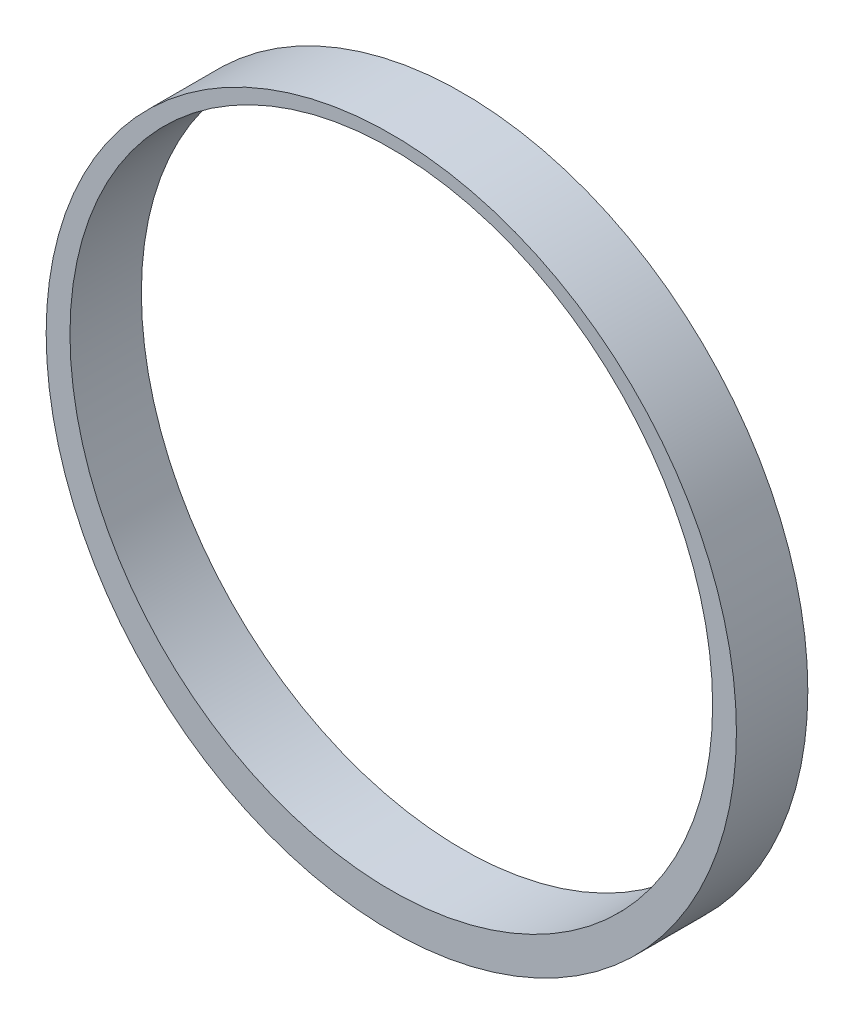
ISO-10303-21;
HEADER;
FILE_DESCRIPTION(('STEP AP214'),'2;1');
FILE_NAME('part.step','',(''),(''),'','','');
FILE_SCHEMA(('AUTOMOTIVE_DESIGN { 1 0 10303 214 1 1 1 1 }'));
ENDSEC;
DATA;
#1=APPLICATION_CONTEXT('core data for automotive mechanical design processes');
#2=APPLICATION_PROTOCOL_DEFINITION('international standard','automotive_design',2000,#1);
#3=PRODUCT_CONTEXT('',#1,'mechanical');
#4=PRODUCT('Part','Part','',(#3));
#5=PRODUCT_RELATED_PRODUCT_CATEGORY('part','',(#4));
#6=PRODUCT_DEFINITION_FORMATION('','',#4);
#7=PRODUCT_DEFINITION_CONTEXT('part definition',#1,'design');
#8=PRODUCT_DEFINITION('design','',#6,#7);
#9=PRODUCT_DEFINITION_SHAPE('','',#8);
#10=(LENGTH_UNIT() NAMED_UNIT(*) SI_UNIT(.MILLI.,.METRE.));
#11=(NAMED_UNIT(*) PLANE_ANGLE_UNIT() SI_UNIT($,.RADIAN.));
#12=(NAMED_UNIT(*) SI_UNIT($,.STERADIAN.) SOLID_ANGLE_UNIT());
#13=UNCERTAINTY_MEASURE_WITH_UNIT(LENGTH_MEASURE(1.E-05),#10,'distance_accuracy_value','');
#14=(GEOMETRIC_REPRESENTATION_CONTEXT(3) GLOBAL_UNCERTAINTY_ASSIGNED_CONTEXT((#13)) GLOBAL_UNIT_ASSIGNED_CONTEXT((#10,
#11,#12)) REPRESENTATION_CONTEXT('',''));
#15=CARTESIAN_POINT('',(0.,0.,0.));
#16=DIRECTION('',(0.,0.,1.));
#17=DIRECTION('',(1.,0.,0.));
#18=AXIS2_PLACEMENT_3D('',#15,#16,#17);
#19=CARTESIAN_POINT('',(0.,-1.89658520093627,12.));
#20=DIRECTION('',(0.,0.,-1.));
#21=DIRECTION('',(-1.,0.,0.));
#22=AXIS2_PLACEMENT_3D('',#19,#20,#21);
#23=CYLINDRICAL_SURFACE('',#22,58.);
#24=CARTESIAN_POINT('',(0.,-1.89658520093627,12.));
#25=DIRECTION('',(0.,0.,1.));
#26=DIRECTION('',(1.,0.,0.));
#27=AXIS2_PLACEMENT_3D('',#24,#25,#26);
#28=CIRCLE('',#27,58.);
#29=CARTESIAN_POINT('',(58.,-1.89658520093627,12.));
#30=VERTEX_POINT('',#29);
#31=EDGE_CURVE('E10',#30,#30,#28,.T.);
#32=ORIENTED_EDGE('',*,*,#31,.F.);
#33=EDGE_LOOP('',(#32));
#34=FACE_BOUND('',#33,.T.);
#35=CARTESIAN_POINT('',(0.,-1.89658520093627,0.));
#36=DIRECTION('',(0.,0.,1.));
#37=DIRECTION('',(1.,0.,0.));
#38=AXIS2_PLACEMENT_3D('',#35,#36,#37);
#39=CIRCLE('',#38,58.);
#40=CARTESIAN_POINT('',(58.,-1.89658520093627,0.));
#41=VERTEX_POINT('',#40);
#42=EDGE_CURVE('E34',#41,#41,#39,.T.);
#43=ORIENTED_EDGE('',*,*,#42,.T.);
#44=EDGE_LOOP('',(#43));
#45=FACE_BOUND('',#44,.T.);
#46=ADVANCED_FACE('F31',(#34,#45),#23,.T.);
#47=CARTESIAN_POINT('',(0.,-1.89658520093627,12.));
#48=DIRECTION('',(0.,0.,1.));
#49=DIRECTION('',(1.,0.,0.));
#50=AXIS2_PLACEMENT_3D('',#47,#48,#49);
#51=PLANE('',#50);
#52=CARTESIAN_POINT('',(0.,0.,12.));
#53=DIRECTION('',(0.,0.,1.));
#54=DIRECTION('',(1.,0.,0.));
#55=AXIS2_PLACEMENT_3D('',#52,#53,#54);
#56=CIRCLE('',#55,54.);
#57=CARTESIAN_POINT('',(54.,0.,12.));
#58=VERTEX_POINT('',#57);
#59=EDGE_CURVE('E41',#58,#58,#56,.F.);
#60=ORIENTED_EDGE('',*,*,#59,.T.);
#61=EDGE_LOOP('',(#60));
#62=FACE_BOUND('',#61,.T.);
#63=ORIENTED_EDGE('',*,*,#31,.T.);
#64=EDGE_LOOP('',(#63));
#65=FACE_BOUND('',#64,.T.);
#66=ADVANCED_FACE('F59',(#62,#65),#51,.T.);
#67=CARTESIAN_POINT('',(0.,-1.89658520093627,0.));
#68=DIRECTION('',(0.,0.,1.));
#69=DIRECTION('',(1.,0.,0.));
#70=AXIS2_PLACEMENT_3D('',#67,#68,#69);
#71=PLANE('',#70);
#72=CARTESIAN_POINT('',(0.,0.,0.));
#73=DIRECTION('',(0.,0.,1.));
#74=DIRECTION('',(1.,0.,0.));
#75=AXIS2_PLACEMENT_3D('',#72,#73,#74);
#76=CIRCLE('',#75,54.);
#77=CARTESIAN_POINT('',(54.,0.,0.));
#78=VERTEX_POINT('',#77);
#79=EDGE_CURVE('E45',#78,#78,#76,.T.);
#80=ORIENTED_EDGE('',*,*,#79,.T.);
#81=EDGE_LOOP('',(#80));
#82=FACE_BOUND('',#81,.T.);
#83=ORIENTED_EDGE('',*,*,#42,.F.);
#84=EDGE_LOOP('',(#83));
#85=FACE_BOUND('',#84,.T.);
#86=ADVANCED_FACE('F49',(#82,#85),#71,.F.);
#87=CARTESIAN_POINT('',(0.,0.,23.));
#88=DIRECTION('',(0.,0.,-1.));
#89=DIRECTION('',(-1.,0.,0.));
#90=AXIS2_PLACEMENT_3D('',#87,#88,#89);
#91=CYLINDRICAL_SURFACE('',#90,54.);
#92=ORIENTED_EDGE('',*,*,#59,.F.);
#93=EDGE_LOOP('',(#92));
#94=FACE_BOUND('',#93,.T.);
#95=ORIENTED_EDGE('',*,*,#79,.F.);
#96=EDGE_LOOP('',(#95));
#97=FACE_BOUND('',#96,.T.);
#98=ADVANCED_FACE('F52',(#94,#97),#91,.F.);
#99=CLOSED_SHELL('',(#46,#66,#86,#98));
#100=MANIFOLD_SOLID_BREP('B2',#99);
#101=ADVANCED_BREP_SHAPE_REPRESENTATION('',(#18,#100),#14);
#102=SHAPE_DEFINITION_REPRESENTATION(#9,#101);
ENDSEC;
END-ISO-10303-21;
